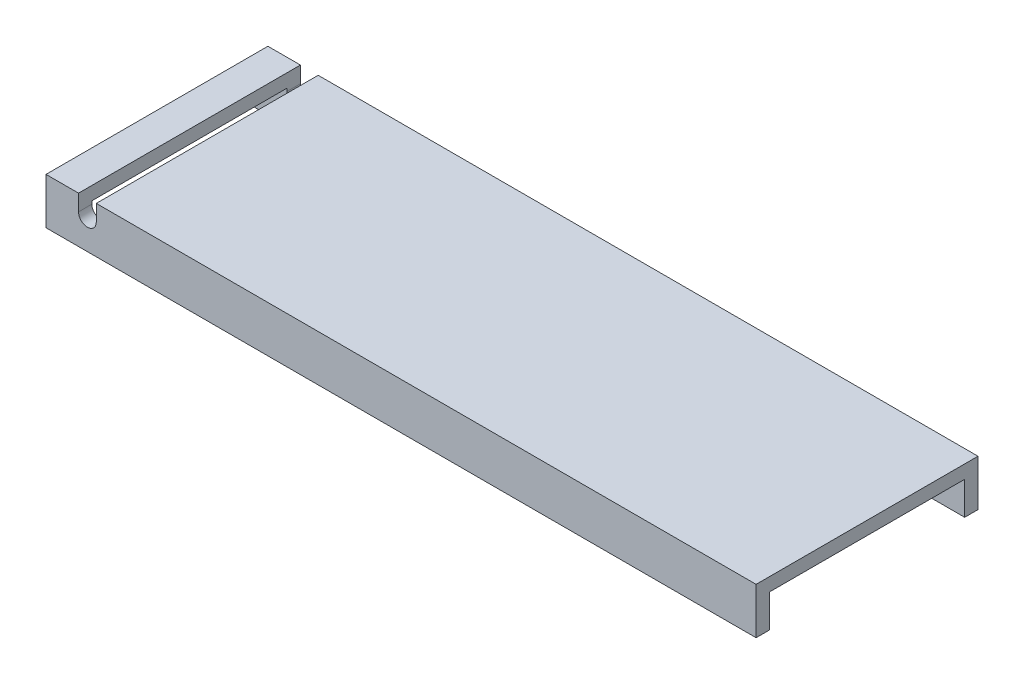
ISO-10303-21;
HEADER;
FILE_DESCRIPTION(('STEP AP214'),'2;1');
FILE_NAME('part.step','',(''),(''),'','','');
FILE_SCHEMA(('AUTOMOTIVE_DESIGN { 1 0 10303 214 1 1 1 1 }'));
ENDSEC;
DATA;
#1=APPLICATION_CONTEXT('core data for automotive mechanical design processes');
#2=APPLICATION_PROTOCOL_DEFINITION('international standard','automotive_design',2000,#1);
#3=PRODUCT_CONTEXT('',#1,'mechanical');
#4=PRODUCT('Part','Part','',(#3));
#5=PRODUCT_RELATED_PRODUCT_CATEGORY('part','',(#4));
#6=PRODUCT_DEFINITION_FORMATION('','',#4);
#7=PRODUCT_DEFINITION_CONTEXT('part definition',#1,'design');
#8=PRODUCT_DEFINITION('design','',#6,#7);
#9=PRODUCT_DEFINITION_SHAPE('','',#8);
#10=(LENGTH_UNIT() NAMED_UNIT(*) SI_UNIT(.MILLI.,.METRE.));
#11=(NAMED_UNIT(*) PLANE_ANGLE_UNIT() SI_UNIT($,.RADIAN.));
#12=(NAMED_UNIT(*) SI_UNIT($,.STERADIAN.) SOLID_ANGLE_UNIT());
#13=UNCERTAINTY_MEASURE_WITH_UNIT(LENGTH_MEASURE(1.E-05),#10,'distance_accuracy_value','');
#14=(GEOMETRIC_REPRESENTATION_CONTEXT(3) GLOBAL_UNCERTAINTY_ASSIGNED_CONTEXT((#13)) GLOBAL_UNIT_ASSIGNED_CONTEXT((#10,
#11,#12)) REPRESENTATION_CONTEXT('',''));
#15=CARTESIAN_POINT('',(0.,0.,0.));
#16=DIRECTION('',(0.,0.,1.));
#17=DIRECTION('',(1.,0.,0.));
#18=AXIS2_PLACEMENT_3D('',#15,#16,#17);
#19=CARTESIAN_POINT('',(80.,5.21244869017925,11.3910246677827));
#20=DIRECTION('',(0.,-1.,0.));
#21=DIRECTION('',(0.,0.,-1.));
#22=AXIS2_PLACEMENT_3D('',#19,#20,#21);
#23=PLANE('',#22);
#24=DIRECTION('',(-1.,0.,0.));
#25=VECTOR('',#24,1.);
#26=CARTESIAN_POINT('',(80.,5.21244869017925,11.3910246677827));
#27=LINE('',#26,#25);
#28=CARTESIAN_POINT('',(3.66430597917494,5.21244869017925,11.3910246677827));
#29=VERTEX_POINT('',#28);
#30=CARTESIAN_POINT('',(0.,5.21244869017925,11.3910246677827));
#31=VERTEX_POINT('',#30);
#32=EDGE_CURVE('E260',#29,#31,#27,.T.);
#33=ORIENTED_EDGE('',*,*,#32,.F.);
#34=DIRECTION('',(0.,0.,1.));
#35=VECTOR('',#34,1.);
#36=CARTESIAN_POINT('',(3.66430597917494,5.21244869017925,-38.6089753322173));
#37=LINE('',#36,#35);
#38=CARTESIAN_POINT('',(3.66430597917494,5.21244869017925,-13.6089753322173));
#39=VERTEX_POINT('',#38);
#40=EDGE_CURVE('E183',#39,#29,#37,.T.);
#41=ORIENTED_EDGE('',*,*,#40,.F.);
#42=DIRECTION('',(-1.,0.,0.));
#43=VECTOR('',#42,1.);
#44=CARTESIAN_POINT('',(80.,5.21244869017925,-13.6089753322173));
#45=LINE('',#44,#43);
#46=CARTESIAN_POINT('',(0.,5.21244869017925,-13.6089753322173));
#47=VERTEX_POINT('',#46);
#48=EDGE_CURVE('E249',#39,#47,#45,.T.);
#49=ORIENTED_EDGE('',*,*,#48,.T.);
#50=DIRECTION('',(0.,0.,1.));
#51=VECTOR('',#50,1.);
#52=CARTESIAN_POINT('',(0.,5.21244869017925,11.3910246677827));
#53=LINE('',#52,#51);
#54=EDGE_CURVE('E239',#47,#31,#53,.T.);
#55=ORIENTED_EDGE('',*,*,#54,.T.);
#56=EDGE_LOOP('',(#33,#41,#49,#55));
#57=FACE_BOUND('',#56,.T.);
#58=ADVANCED_FACE('F41',(#57),#23,.F.);
#59=CARTESIAN_POINT('',(80.,3.71244869017925,9.89102466778274));
#60=DIRECTION('',(0.,-1.,0.));
#61=DIRECTION('',(0.,0.,-1.));
#62=AXIS2_PLACEMENT_3D('',#59,#60,#61);
#63=PLANE('',#62);
#64=DIRECTION('',(0.,0.,-1.));
#65=VECTOR('',#64,1.);
#66=CARTESIAN_POINT('',(3.66430597917494,3.71244869017925,9.89102466778274));
#67=LINE('',#66,#65);
#68=CARTESIAN_POINT('',(3.66430597917494,3.71244869017925,9.89102466778274));
#69=VERTEX_POINT('',#68);
#70=CARTESIAN_POINT('',(3.66430597917494,3.71244869017925,-12.1089753322173));
#71=VERTEX_POINT('',#70);
#72=EDGE_CURVE('E204',#69,#71,#67,.T.);
#73=ORIENTED_EDGE('',*,*,#72,.F.);
#74=DIRECTION('',(-1.,0.,0.));
#75=VECTOR('',#74,1.);
#76=CARTESIAN_POINT('',(80.,3.71244869017925,9.89102466778274));
#77=LINE('',#76,#75);
#78=CARTESIAN_POINT('',(0.,3.71244869017925,9.89102466778274));
#79=VERTEX_POINT('',#78);
#80=EDGE_CURVE('E225',#69,#79,#77,.T.);
#81=ORIENTED_EDGE('',*,*,#80,.T.);
#82=DIRECTION('',(0.,0.,1.));
#83=VECTOR('',#82,1.);
#84=CARTESIAN_POINT('',(0.,3.71244869017925,9.89102466778274));
#85=LINE('',#84,#83);
#86=CARTESIAN_POINT('',(0.,3.71244869017925,-12.1089753322173));
#87=VERTEX_POINT('',#86);
#88=EDGE_CURVE('E227',#87,#79,#85,.T.);
#89=ORIENTED_EDGE('',*,*,#88,.F.);
#90=DIRECTION('',(-1.,0.,0.));
#91=VECTOR('',#90,1.);
#92=CARTESIAN_POINT('',(80.,3.71244869017925,-12.1089753322173));
#93=LINE('',#92,#91);
#94=EDGE_CURVE('E235',#71,#87,#93,.T.);
#95=ORIENTED_EDGE('',*,*,#94,.F.);
#96=EDGE_LOOP('',(#73,#81,#89,#95));
#97=FACE_BOUND('',#96,.T.);
#98=ADVANCED_FACE('F275',(#97),#63,.T.);
#99=CARTESIAN_POINT('',(80.,0.,0.));
#100=DIRECTION('',(-1.,0.,0.));
#101=DIRECTION('',(0.,0.,1.));
#102=AXIS2_PLACEMENT_3D('',#99,#100,#101);
#103=PLANE('',#102);
#104=DIRECTION('',(0.,-1.,0.));
#105=VECTOR('',#104,1.);
#106=CARTESIAN_POINT('',(80.,5.21244869017925,11.3910246677827));
#107=LINE('',#106,#105);
#108=CARTESIAN_POINT('',(80.,5.21244869017925,11.3910246677827));
#109=VERTEX_POINT('',#108);
#110=CARTESIAN_POINT('',(80.,0.,11.3910246677827));
#111=VERTEX_POINT('',#110);
#112=EDGE_CURVE('E243',#109,#111,#107,.T.);
#113=ORIENTED_EDGE('',*,*,#112,.T.);
#114=DIRECTION('',(0.,0.,-1.));
#115=VECTOR('',#114,1.);
#116=CARTESIAN_POINT('',(80.,0.,0.));
#117=LINE('',#116,#115);
#118=CARTESIAN_POINT('',(80.,0.,9.89102466778274));
#119=VERTEX_POINT('',#118);
#120=EDGE_CURVE('E189',#111,#119,#117,.T.);
#121=ORIENTED_EDGE('',*,*,#120,.T.);
#122=DIRECTION('',(0.,-1.,0.));
#123=VECTOR('',#122,1.);
#124=CARTESIAN_POINT('',(80.,3.71244869017925,9.89102466778274));
#125=LINE('',#124,#123);
#126=CARTESIAN_POINT('',(80.,3.71244869017925,9.89102466778274));
#127=VERTEX_POINT('',#126);
#128=EDGE_CURVE('E222',#127,#119,#125,.T.);
#129=ORIENTED_EDGE('',*,*,#128,.F.);
#130=DIRECTION('',(0.,0.,1.));
#131=VECTOR('',#130,1.);
#132=CARTESIAN_POINT('',(80.,3.71244869017925,9.89102466778274));
#133=LINE('',#132,#131);
#134=CARTESIAN_POINT('',(80.,3.71244869017925,-12.1089753322173));
#135=VERTEX_POINT('',#134);
#136=EDGE_CURVE('E219',#135,#127,#133,.T.);
#137=ORIENTED_EDGE('',*,*,#136,.F.);
#138=DIRECTION('',(0.,1.,0.));
#139=VECTOR('',#138,1.);
#140=CARTESIAN_POINT('',(80.,3.71244869017925,-12.1089753322173));
#141=LINE('',#140,#139);
#142=CARTESIAN_POINT('',(80.,0.,-12.1089753322173));
#143=VERTEX_POINT('',#142);
#144=EDGE_CURVE('E217',#143,#135,#141,.T.);
#145=ORIENTED_EDGE('',*,*,#144,.F.);
#146=CARTESIAN_POINT('',(80.,0.,-13.6089753322173));
#147=VERTEX_POINT('',#146);
#148=EDGE_CURVE('E64',#143,#147,#117,.T.);
#149=ORIENTED_EDGE('',*,*,#148,.T.);
#150=DIRECTION('',(0.,1.,0.));
#151=VECTOR('',#150,1.);
#152=CARTESIAN_POINT('',(80.,5.21244869017925,-13.6089753322173));
#153=LINE('',#152,#151);
#154=CARTESIAN_POINT('',(80.,5.21244869017925,-13.6089753322173));
#155=VERTEX_POINT('',#154);
#156=EDGE_CURVE('E247',#147,#155,#153,.T.);
#157=ORIENTED_EDGE('',*,*,#156,.T.);
#158=DIRECTION('',(0.,0.,1.));
#159=VECTOR('',#158,1.);
#160=CARTESIAN_POINT('',(80.,5.21244869017925,11.3910246677827));
#161=LINE('',#160,#159);
#162=EDGE_CURVE('E240',#155,#109,#161,.T.);
#163=ORIENTED_EDGE('',*,*,#162,.T.);
#164=EDGE_LOOP('',(#113,#121,#129,#137,#145,#149,#157,#163));
#165=FACE_BOUND('',#164,.T.);
#166=ADVANCED_FACE('F298',(#165),#103,.F.);
#167=CARTESIAN_POINT('',(0.,0.,0.));
#168=DIRECTION('',(-1.,0.,0.));
#169=DIRECTION('',(0.,0.,1.));
#170=AXIS2_PLACEMENT_3D('',#167,#168,#169);
#171=PLANE('',#170);
#172=DIRECTION('',(0.,0.,-1.));
#173=VECTOR('',#172,1.);
#174=CARTESIAN_POINT('',(0.,0.,0.));
#175=LINE('',#174,#173);
#176=CARTESIAN_POINT('',(0.,0.,11.3910246677827));
#177=VERTEX_POINT('',#176);
#178=CARTESIAN_POINT('',(0.,0.,9.89102466778274));
#179=VERTEX_POINT('',#178);
#180=EDGE_CURVE('E187',#177,#179,#175,.T.);
#181=ORIENTED_EDGE('',*,*,#180,.F.);
#182=DIRECTION('',(0.,-1.,0.));
#183=VECTOR('',#182,1.);
#184=CARTESIAN_POINT('',(0.,5.21244869017925,11.3910246677827));
#185=LINE('',#184,#183);
#186=EDGE_CURVE('E252',#31,#177,#185,.T.);
#187=ORIENTED_EDGE('',*,*,#186,.F.);
#188=ORIENTED_EDGE('',*,*,#54,.F.);
#189=DIRECTION('',(0.,1.,0.));
#190=VECTOR('',#189,1.);
#191=CARTESIAN_POINT('',(0.,5.21244869017925,-13.6089753322173));
#192=LINE('',#191,#190);
#193=CARTESIAN_POINT('',(0.,0.,-13.6089753322173));
#194=VERTEX_POINT('',#193);
#195=EDGE_CURVE('E244',#194,#47,#192,.T.);
#196=ORIENTED_EDGE('',*,*,#195,.F.);
#197=CARTESIAN_POINT('',(0.,0.,-12.1089753322173));
#198=VERTEX_POINT('',#197);
#199=EDGE_CURVE('E190',#198,#194,#175,.T.);
#200=ORIENTED_EDGE('',*,*,#199,.F.);
#201=DIRECTION('',(0.,1.,0.));
#202=VECTOR('',#201,1.);
#203=CARTESIAN_POINT('',(0.,3.71244869017925,-12.1089753322173));
#204=LINE('',#203,#202);
#205=EDGE_CURVE('E216',#198,#87,#204,.T.);
#206=ORIENTED_EDGE('',*,*,#205,.T.);
#207=ORIENTED_EDGE('',*,*,#88,.T.);
#208=DIRECTION('',(0.,-1.,0.));
#209=VECTOR('',#208,1.);
#210=CARTESIAN_POINT('',(0.,3.71244869017925,9.89102466778274));
#211=LINE('',#210,#209);
#212=EDGE_CURVE('E220',#79,#179,#211,.T.);
#213=ORIENTED_EDGE('',*,*,#212,.T.);
#214=EDGE_LOOP('',(#181,#187,#188,#196,#200,#206,#207,#213));
#215=FACE_BOUND('',#214,.T.);
#216=ADVANCED_FACE('F305',(#215),#171,.T.);
#217=CARTESIAN_POINT('',(5.66430597917494,5.21244869017925,-13.6089753322173));
#218=VERTEX_POINT('',#217);
#219=EDGE_CURVE('E257',#155,#218,#45,.T.);
#220=ORIENTED_EDGE('',*,*,#219,.T.);
#221=DIRECTION('',(0.,0.,1.));
#222=VECTOR('',#221,1.);
#223=CARTESIAN_POINT('',(5.66430597917494,5.21244869017925,-38.6089753322173));
#224=LINE('',#223,#222);
#225=CARTESIAN_POINT('',(5.66430597917494,5.21244869017925,11.3910246677827));
#226=VERTEX_POINT('',#225);
#227=EDGE_CURVE('E56',#218,#226,#224,.T.);
#228=ORIENTED_EDGE('',*,*,#227,.T.);
#229=EDGE_CURVE('E177',#109,#226,#27,.T.);
#230=ORIENTED_EDGE('',*,*,#229,.F.);
#231=ORIENTED_EDGE('',*,*,#162,.F.);
#232=EDGE_LOOP('',(#220,#228,#230,#231));
#233=FACE_BOUND('',#232,.T.);
#234=ADVANCED_FACE('F43',(#233),#23,.F.);
#235=CARTESIAN_POINT('',(80.,5.21244869017925,11.3910246677827));
#236=DIRECTION('',(0.,0.,-1.));
#237=DIRECTION('',(0.,1.,0.));
#238=AXIS2_PLACEMENT_3D('',#235,#236,#237);
#239=PLANE('',#238);
#240=CARTESIAN_POINT('',(4.66430597917495,3.38727960637531,11.3910246677827));
#241=DIRECTION('',(0.,0.,1.));
#242=DIRECTION('',(1.,0.,0.));
#243=AXIS2_PLACEMENT_3D('',#240,#241,#242);
#244=CIRCLE('',#243,1.);
#245=CARTESIAN_POINT('',(3.66430597917495,3.38727960637531,11.3910246677827));
#246=VERTEX_POINT('',#245);
#247=CARTESIAN_POINT('',(5.66430597917495,3.38727960637531,11.3910246677827));
#248=VERTEX_POINT('',#247);
#249=EDGE_CURVE('E165',#246,#248,#244,.T.);
#250=ORIENTED_EDGE('',*,*,#249,.F.);
#251=DIRECTION('',(0.,-1.,0.));
#252=VECTOR('',#251,1.);
#253=CARTESIAN_POINT('',(3.66430597917495,3.38727960637531,11.3910246677827));
#254=LINE('',#253,#252);
#255=EDGE_CURVE('E162',#29,#246,#254,.T.);
#256=ORIENTED_EDGE('',*,*,#255,.F.);
#257=ORIENTED_EDGE('',*,*,#32,.T.);
#258=ORIENTED_EDGE('',*,*,#186,.T.);
#259=DIRECTION('',(-1.,0.,0.));
#260=VECTOR('',#259,1.);
#261=CARTESIAN_POINT('',(-3.21348539826178,0.,11.3910246677827));
#262=LINE('',#261,#260);
#263=EDGE_CURVE('E172',#111,#177,#262,.T.);
#264=ORIENTED_EDGE('',*,*,#263,.F.);
#265=ORIENTED_EDGE('',*,*,#112,.F.);
#266=ORIENTED_EDGE('',*,*,#229,.T.);
#267=DIRECTION('',(0.,1.,0.));
#268=VECTOR('',#267,1.);
#269=CARTESIAN_POINT('',(5.66430597917495,3.38727960637531,11.3910246677827));
#270=LINE('',#269,#268);
#271=EDGE_CURVE('E156',#248,#226,#270,.T.);
#272=ORIENTED_EDGE('',*,*,#271,.F.);
#273=EDGE_LOOP('',(#250,#256,#257,#258,#264,#265,#266,#272));
#274=FACE_BOUND('',#273,.T.);
#275=ADVANCED_FACE('F175',(#274),#239,.F.);
#276=CARTESIAN_POINT('',(80.,5.21244869017925,-13.6089753322173));
#277=DIRECTION('',(0.,0.,1.));
#278=DIRECTION('',(1.,0.,0.));
#279=AXIS2_PLACEMENT_3D('',#276,#277,#278);
#280=PLANE('',#279);
#281=ORIENTED_EDGE('',*,*,#48,.F.);
#282=DIRECTION('',(0.,-1.,0.));
#283=VECTOR('',#282,1.);
#284=CARTESIAN_POINT('',(3.66430597917494,5.21244869017907,-13.6089753322173));
#285=LINE('',#284,#283);
#286=CARTESIAN_POINT('',(3.66430597917495,3.38727960637531,-13.6089753322173));
#287=VERTEX_POINT('',#286);
#288=EDGE_CURVE('E208',#39,#287,#285,.T.);
#289=ORIENTED_EDGE('',*,*,#288,.T.);
#290=CARTESIAN_POINT('',(4.66430597917495,3.38727960637531,-13.6089753322173));
#291=DIRECTION('',(0.,0.,1.));
#292=DIRECTION('',(1.,0.,0.));
#293=AXIS2_PLACEMENT_3D('',#290,#291,#292);
#294=CIRCLE('',#293,1.);
#295=CARTESIAN_POINT('',(5.66430597917495,3.38727960637531,-13.6089753322173));
#296=VERTEX_POINT('',#295);
#297=EDGE_CURVE('E213',#287,#296,#294,.T.);
#298=ORIENTED_EDGE('',*,*,#297,.T.);
#299=DIRECTION('',(0.,1.,0.));
#300=VECTOR('',#299,1.);
#301=CARTESIAN_POINT('',(5.66430597917494,5.21244869017918,-13.6089753322173));
#302=LINE('',#301,#300);
#303=EDGE_CURVE('E202',#296,#218,#302,.T.);
#304=ORIENTED_EDGE('',*,*,#303,.T.);
#305=ORIENTED_EDGE('',*,*,#219,.F.);
#306=ORIENTED_EDGE('',*,*,#156,.F.);
#307=DIRECTION('',(-1.,0.,0.));
#308=VECTOR('',#307,1.);
#309=CARTESIAN_POINT('',(80.,0.,-13.6089753322173));
#310=LINE('',#309,#308);
#311=EDGE_CURVE('E195',#147,#194,#310,.T.);
#312=ORIENTED_EDGE('',*,*,#311,.T.);
#313=ORIENTED_EDGE('',*,*,#195,.T.);
#314=EDGE_LOOP('',(#281,#289,#298,#304,#305,#306,#312,#313));
#315=FACE_BOUND('',#314,.T.);
#316=ADVANCED_FACE('F293',(#315),#280,.F.);
#317=CARTESIAN_POINT('',(80.,3.71244869017925,-12.1089753322173));
#318=DIRECTION('',(0.,0.,1.));
#319=DIRECTION('',(1.,0.,0.));
#320=AXIS2_PLACEMENT_3D('',#317,#318,#319);
#321=PLANE('',#320);
#322=DIRECTION('',(0.,-1.,0.));
#323=VECTOR('',#322,1.);
#324=CARTESIAN_POINT('',(3.66430597917494,3.71244869017907,-12.1089753322173));
#325=LINE('',#324,#323);
#326=CARTESIAN_POINT('',(3.66430597917495,3.38727960637531,-12.1089753322173));
#327=VERTEX_POINT('',#326);
#328=EDGE_CURVE('E206',#71,#327,#325,.T.);
#329=ORIENTED_EDGE('',*,*,#328,.F.);
#330=ORIENTED_EDGE('',*,*,#94,.T.);
#331=ORIENTED_EDGE('',*,*,#205,.F.);
#332=DIRECTION('',(-1.,0.,0.));
#333=VECTOR('',#332,1.);
#334=CARTESIAN_POINT('',(80.,0.,-12.1089753322173));
#335=LINE('',#334,#333);
#336=EDGE_CURVE('E193',#143,#198,#335,.T.);
#337=ORIENTED_EDGE('',*,*,#336,.F.);
#338=ORIENTED_EDGE('',*,*,#144,.T.);
#339=CARTESIAN_POINT('',(5.66430597917494,3.71244869017925,-12.1089753322173));
#340=VERTEX_POINT('',#339);
#341=EDGE_CURVE('E236',#135,#340,#93,.T.);
#342=ORIENTED_EDGE('',*,*,#341,.T.);
#343=DIRECTION('',(0.,1.,0.));
#344=VECTOR('',#343,1.);
#345=CARTESIAN_POINT('',(5.66430597917494,3.71244869017918,-12.1089753322173));
#346=LINE('',#345,#344);
#347=CARTESIAN_POINT('',(5.66430597917495,3.38727960637531,-12.1089753322173));
#348=VERTEX_POINT('',#347);
#349=EDGE_CURVE('E200',#348,#340,#346,.T.);
#350=ORIENTED_EDGE('',*,*,#349,.F.);
#351=CARTESIAN_POINT('',(4.66430597917495,3.38727960637531,-12.1089753322173));
#352=DIRECTION('',(0.,0.,1.));
#353=DIRECTION('',(1.,0.,0.));
#354=AXIS2_PLACEMENT_3D('',#351,#352,#353);
#355=CIRCLE('',#354,1.);
#356=EDGE_CURVE('E211',#327,#348,#355,.T.);
#357=ORIENTED_EDGE('',*,*,#356,.F.);
#358=EDGE_LOOP('',(#329,#330,#331,#337,#338,#342,#350,#357));
#359=FACE_BOUND('',#358,.T.);
#360=ADVANCED_FACE('F283',(#359),#321,.T.);
#361=DIRECTION('',(0.,0.,1.));
#362=VECTOR('',#361,1.);
#363=CARTESIAN_POINT('',(5.66430597917494,3.71244869017925,9.89102466778274));
#364=LINE('',#363,#362);
#365=CARTESIAN_POINT('',(5.66430597917494,3.71244869017925,9.89102466778274));
#366=VERTEX_POINT('',#365);
#367=EDGE_CURVE('E198',#340,#366,#364,.T.);
#368=ORIENTED_EDGE('',*,*,#367,.F.);
#369=ORIENTED_EDGE('',*,*,#341,.F.);
#370=ORIENTED_EDGE('',*,*,#136,.T.);
#371=EDGE_CURVE('E232',#127,#366,#77,.T.);
#372=ORIENTED_EDGE('',*,*,#371,.T.);
#373=EDGE_LOOP('',(#368,#369,#370,#372));
#374=FACE_BOUND('',#373,.T.);
#375=ADVANCED_FACE('F318',(#374),#63,.T.);
#376=CARTESIAN_POINT('',(80.,3.71244869017925,9.89102466778274));
#377=DIRECTION('',(0.,0.,-1.));
#378=DIRECTION('',(0.,1.,0.));
#379=AXIS2_PLACEMENT_3D('',#376,#377,#378);
#380=PLANE('',#379);
#381=DIRECTION('',(0.,1.,0.));
#382=VECTOR('',#381,1.);
#383=CARTESIAN_POINT('',(3.66430597917494,3.71244869017907,9.89102466778274));
#384=LINE('',#383,#382);
#385=CARTESIAN_POINT('',(3.66430597917495,3.38727960637531,9.89102466778274));
#386=VERTEX_POINT('',#385);
#387=EDGE_CURVE('E11',#386,#69,#384,.T.);
#388=ORIENTED_EDGE('',*,*,#387,.F.);
#389=CARTESIAN_POINT('',(4.66430597917495,3.38727960637531,9.89102466778274));
#390=DIRECTION('',(0.,0.,-1.));
#391=DIRECTION('',(0.,1.,0.));
#392=AXIS2_PLACEMENT_3D('',#389,#390,#391);
#393=CIRCLE('',#392,1.);
#394=CARTESIAN_POINT('',(5.66430597917495,3.38727960637531,9.89102466778274));
#395=VERTEX_POINT('',#394);
#396=EDGE_CURVE('E49',#395,#386,#393,.T.);
#397=ORIENTED_EDGE('',*,*,#396,.F.);
#398=DIRECTION('',(0.,-1.,0.));
#399=VECTOR('',#398,1.);
#400=CARTESIAN_POINT('',(5.66430597917494,3.71244869017918,9.89102466778274));
#401=LINE('',#400,#399);
#402=EDGE_CURVE('E158',#366,#395,#401,.T.);
#403=ORIENTED_EDGE('',*,*,#402,.F.);
#404=ORIENTED_EDGE('',*,*,#371,.F.);
#405=ORIENTED_EDGE('',*,*,#128,.T.);
#406=DIRECTION('',(1.,0.,0.));
#407=VECTOR('',#406,1.);
#408=CARTESIAN_POINT('',(80.,0.,9.89102466778274));
#409=LINE('',#408,#407);
#410=EDGE_CURVE('E262',#179,#119,#409,.T.);
#411=ORIENTED_EDGE('',*,*,#410,.F.);
#412=ORIENTED_EDGE('',*,*,#212,.F.);
#413=ORIENTED_EDGE('',*,*,#80,.F.);
#414=EDGE_LOOP('',(#388,#397,#403,#404,#405,#411,#412,#413));
#415=FACE_BOUND('',#414,.T.);
#416=ADVANCED_FACE('F270',(#415),#380,.T.);
#417=CARTESIAN_POINT('',(-3.21348539826178,0.,-38.6089753322173));
#418=DIRECTION('',(0.,1.,0.));
#419=DIRECTION('',(0.,0.,1.));
#420=AXIS2_PLACEMENT_3D('',#417,#418,#419);
#421=PLANE('',#420);
#422=ORIENTED_EDGE('',*,*,#263,.T.);
#423=ORIENTED_EDGE('',*,*,#180,.T.);
#424=ORIENTED_EDGE('',*,*,#410,.T.);
#425=ORIENTED_EDGE('',*,*,#120,.F.);
#426=EDGE_LOOP('',(#422,#423,#424,#425));
#427=FACE_BOUND('',#426,.T.);
#428=ADVANCED_FACE('F312',(#427),#421,.F.);
#429=CARTESIAN_POINT('',(4.66430597917495,3.38727960637531,-38.6089753322173));
#430=DIRECTION('',(0.,0.,1.));
#431=DIRECTION('',(1.,0.,0.));
#432=AXIS2_PLACEMENT_3D('',#429,#430,#431);
#433=CYLINDRICAL_SURFACE('',#432,1.);
#434=DIRECTION('',(0.,0.,1.));
#435=VECTOR('',#434,1.);
#436=CARTESIAN_POINT('',(3.66430597917495,3.38727960637531,-38.6089753322173));
#437=LINE('',#436,#435);
#438=EDGE_CURVE('E182',#287,#327,#437,.T.);
#439=ORIENTED_EDGE('',*,*,#438,.T.);
#440=ORIENTED_EDGE('',*,*,#356,.T.);
#441=DIRECTION('',(0.,0.,1.));
#442=VECTOR('',#441,1.);
#443=CARTESIAN_POINT('',(5.66430597917495,3.38727960637531,-38.6089753322173));
#444=LINE('',#443,#442);
#445=EDGE_CURVE('E161',#296,#348,#444,.T.);
#446=ORIENTED_EDGE('',*,*,#445,.F.);
#447=ORIENTED_EDGE('',*,*,#297,.F.);
#448=EDGE_LOOP('',(#439,#440,#446,#447));
#449=FACE_BOUND('',#448,.T.);
#450=ADVANCED_FACE('F288',(#449),#433,.F.);
#451=CARTESIAN_POINT('',(3.66430597917495,3.38727960637531,-38.6089753322173));
#452=DIRECTION('',(-1.,0.,0.));
#453=DIRECTION('',(0.,-1.,0.));
#454=AXIS2_PLACEMENT_3D('',#451,#452,#453);
#455=PLANE('',#454);
#456=ORIENTED_EDGE('',*,*,#40,.T.);
#457=ORIENTED_EDGE('',*,*,#255,.T.);
#458=EDGE_CURVE('E168',#386,#246,#437,.T.);
#459=ORIENTED_EDGE('',*,*,#458,.F.);
#460=ORIENTED_EDGE('',*,*,#387,.T.);
#461=ORIENTED_EDGE('',*,*,#72,.T.);
#462=ORIENTED_EDGE('',*,*,#328,.T.);
#463=ORIENTED_EDGE('',*,*,#438,.F.);
#464=ORIENTED_EDGE('',*,*,#288,.F.);
#465=EDGE_LOOP('',(#456,#457,#459,#460,#461,#462,#463,#464));
#466=FACE_BOUND('',#465,.T.);
#467=ADVANCED_FACE('F267',(#466),#455,.F.);
#468=CARTESIAN_POINT('',(5.66430597917495,3.38727960637531,-38.6089753322173));
#469=DIRECTION('',(1.,0.,0.));
#470=DIRECTION('',(0.,1.,0.));
#471=AXIS2_PLACEMENT_3D('',#468,#469,#470);
#472=PLANE('',#471);
#473=ORIENTED_EDGE('',*,*,#445,.T.);
#474=ORIENTED_EDGE('',*,*,#349,.T.);
#475=ORIENTED_EDGE('',*,*,#367,.T.);
#476=ORIENTED_EDGE('',*,*,#402,.T.);
#477=EDGE_CURVE('E151',#395,#248,#444,.T.);
#478=ORIENTED_EDGE('',*,*,#477,.T.);
#479=ORIENTED_EDGE('',*,*,#271,.T.);
#480=ORIENTED_EDGE('',*,*,#227,.F.);
#481=ORIENTED_EDGE('',*,*,#303,.F.);
#482=EDGE_LOOP('',(#473,#474,#475,#476,#478,#479,#480,#481));
#483=FACE_BOUND('',#482,.T.);
#484=ADVANCED_FACE('F154',(#483),#472,.F.);
#485=ORIENTED_EDGE('',*,*,#396,.T.);
#486=ORIENTED_EDGE('',*,*,#458,.T.);
#487=ORIENTED_EDGE('',*,*,#249,.T.);
#488=ORIENTED_EDGE('',*,*,#477,.F.);
#489=EDGE_LOOP('',(#485,#486,#487,#488));
#490=FACE_BOUND('',#489,.T.);
#491=ADVANCED_FACE('F166',(#490),#433,.F.);
#492=ORIENTED_EDGE('',*,*,#148,.F.);
#493=ORIENTED_EDGE('',*,*,#336,.T.);
#494=ORIENTED_EDGE('',*,*,#199,.T.);
#495=ORIENTED_EDGE('',*,*,#311,.F.);
#496=EDGE_LOOP('',(#492,#493,#494,#495));
#497=FACE_BOUND('',#496,.T.);
#498=ADVANCED_FACE('F382',(#497),#421,.F.);
#499=CLOSED_SHELL('',(#58,#98,#166,#216,#234,#275,#316,#360,#375,#416,#428,#450,#467,#484,#491,#498));
#500=MANIFOLD_SOLID_BREP('B2',#499);
#501=ADVANCED_BREP_SHAPE_REPRESENTATION('',(#18,#500),#14);
#502=SHAPE_DEFINITION_REPRESENTATION(#9,#501);
ENDSEC;
END-ISO-10303-21;
